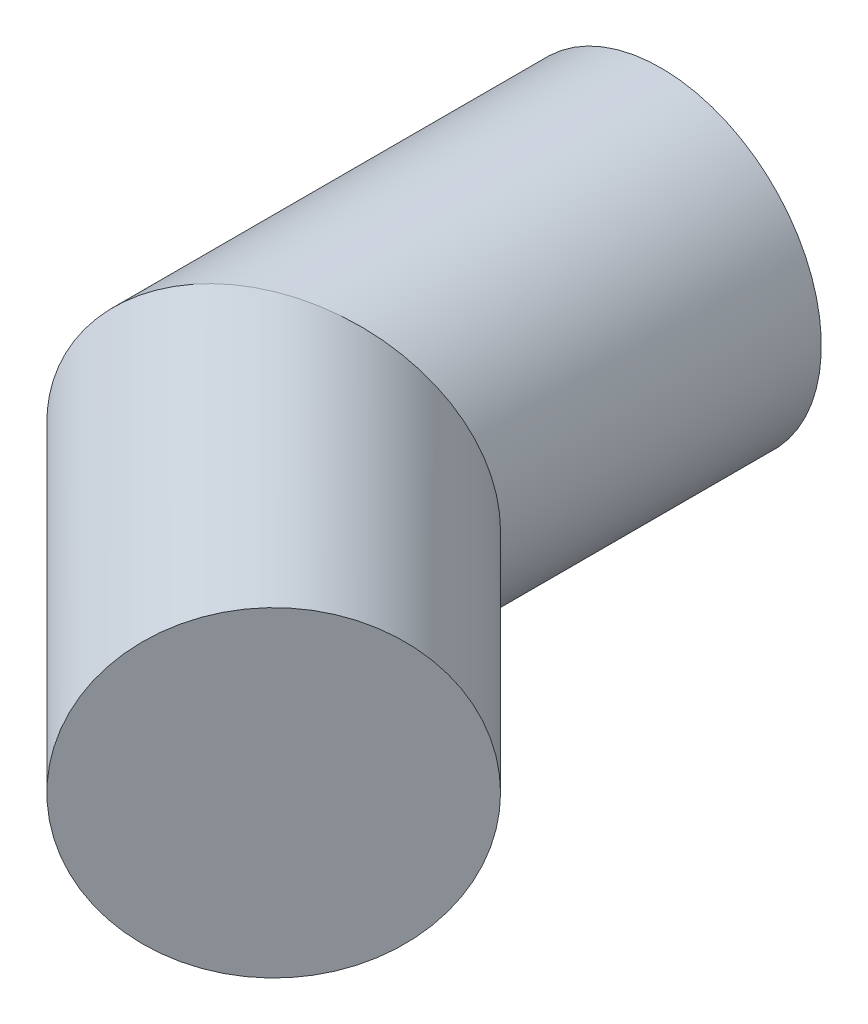
ISO-10303-21;
HEADER;
FILE_DESCRIPTION(('STEP AP214'),'2;1');
FILE_NAME('part.step','',(''),(''),'','','');
FILE_SCHEMA(('AUTOMOTIVE_DESIGN { 1 0 10303 214 1 1 1 1 }'));
ENDSEC;
DATA;
#1=APPLICATION_CONTEXT('core data for automotive mechanical design processes');
#2=APPLICATION_PROTOCOL_DEFINITION('international standard','automotive_design',2000,#1);
#3=PRODUCT_CONTEXT('',#1,'mechanical');
#4=PRODUCT('Part','Part','',(#3));
#5=PRODUCT_RELATED_PRODUCT_CATEGORY('part','',(#4));
#6=PRODUCT_DEFINITION_FORMATION('','',#4);
#7=PRODUCT_DEFINITION_CONTEXT('part definition',#1,'design');
#8=PRODUCT_DEFINITION('design','',#6,#7);
#9=PRODUCT_DEFINITION_SHAPE('','',#8);
#10=(LENGTH_UNIT() NAMED_UNIT(*) SI_UNIT(.MILLI.,.METRE.));
#11=(NAMED_UNIT(*) PLANE_ANGLE_UNIT() SI_UNIT($,.RADIAN.));
#12=(NAMED_UNIT(*) SI_UNIT($,.STERADIAN.) SOLID_ANGLE_UNIT());
#13=UNCERTAINTY_MEASURE_WITH_UNIT(LENGTH_MEASURE(1.E-05),#10,'distance_accuracy_value','');
#14=(GEOMETRIC_REPRESENTATION_CONTEXT(3) GLOBAL_UNCERTAINTY_ASSIGNED_CONTEXT((#13)) GLOBAL_UNIT_ASSIGNED_CONTEXT((#10,
#11,#12)) REPRESENTATION_CONTEXT('',''));
#15=CARTESIAN_POINT('',(0.,0.,0.));
#16=DIRECTION('',(0.,0.,1.));
#17=DIRECTION('',(1.,0.,0.));
#18=AXIS2_PLACEMENT_3D('',#15,#16,#17);
#19=CARTESIAN_POINT('',(-3.87020093855687,2.12701409724207E-06,77.4609394969551));
#20=DIRECTION('',(0.,0.,-1.));
#21=DIRECTION('',(-1.,0.,0.));
#22=AXIS2_PLACEMENT_3D('',#19,#20,#21);
#23=CYLINDRICAL_SURFACE('',#22,20.);
#24=CARTESIAN_POINT('',(-3.87020093855687,2.12701409724207E-06,5.74521074441703));
#25=DIRECTION('',(0.38268343236509,0.,0.923879532511287));
#26=DIRECTION('',(0.923879532511287,0.,-0.38268343236509));
#27=AXIS2_PLACEMENT_3D('',#24,#25,#26);
#28=ELLIPSE('',#27,21.6478440058479,20.);
#29=CARTESIAN_POINT('',(16.1297990614431,2.12701409724207E-06,-2.53906050304487));
#30=VERTEX_POINT('',#29);
#31=EDGE_CURVE('E10',#30,#30,#28,.T.);
#32=ORIENTED_EDGE('',*,*,#31,.F.);
#33=EDGE_LOOP('',(#32));
#34=FACE_BOUND('',#33,.T.);
#35=CARTESIAN_POINT('',(-3.87020093855687,2.12701409724207E-06,-42.5390605030449));
#36=DIRECTION('',(0.,0.,-1.));
#37=DIRECTION('',(-1.,0.,0.));
#38=AXIS2_PLACEMENT_3D('',#35,#36,#37);
#39=CIRCLE('',#38,20.);
#40=CARTESIAN_POINT('',(-23.8702009385569,2.12701409724207E-06,-42.5390605030449));
#41=VERTEX_POINT('',#40);
#42=EDGE_CURVE('E44',#41,#41,#39,.T.);
#43=ORIENTED_EDGE('',*,*,#42,.F.);
#44=EDGE_LOOP('',(#43));
#45=FACE_BOUND('',#44,.T.);
#46=ADVANCED_FACE('F38',(#34,#45),#23,.T.);
#47=CARTESIAN_POINT('',(-54.5808790572116,2.12701409724207E-06,-44.9654673742377));
#48=DIRECTION('',(0.707106781186548,0.,0.707106781186548));
#49=DIRECTION('',(0.707106781186548,0.,-0.707106781186548));
#50=AXIS2_PLACEMENT_3D('',#47,#48,#49);
#51=CYLINDRICAL_SURFACE('',#50,20.);
#52=ORIENTED_EDGE('',*,*,#31,.T.);
#53=EDGE_LOOP('',(#52));
#54=FACE_BOUND('',#53,.T.);
#55=CARTESIAN_POINT('',(30.2719346851741,2.12701409724207E-06,39.887346368148));
#56=DIRECTION('',(0.707106781186548,0.,0.707106781186547));
#57=DIRECTION('',(0.707106781186547,0.,-0.707106781186548));
#58=AXIS2_PLACEMENT_3D('',#55,#56,#57);
#59=CIRCLE('',#58,20.);
#60=CARTESIAN_POINT('',(44.414070308905,2.12701409724207E-06,25.745210744417));
#61=VERTEX_POINT('',#60);
#62=EDGE_CURVE('E48',#61,#61,#59,.T.);
#63=ORIENTED_EDGE('',*,*,#62,.F.);
#64=EDGE_LOOP('',(#63));
#65=FACE_BOUND('',#64,.T.);
#66=ADVANCED_FACE('F57',(#54,#65),#51,.T.);
#67=CARTESIAN_POINT('',(-3.87020093855687,2.12701409724207E-06,-42.5390605030449));
#68=DIRECTION('',(0.,0.,-1.));
#69=DIRECTION('',(-1.,0.,0.));
#70=AXIS2_PLACEMENT_3D('',#67,#68,#69);
#71=PLANE('',#70);
#72=ORIENTED_EDGE('',*,*,#42,.T.);
#73=EDGE_LOOP('',(#72));
#74=FACE_BOUND('',#73,.T.);
#75=ADVANCED_FACE('F59',(#74),#71,.T.);
#76=CARTESIAN_POINT('',(30.2719346851741,2.12701409724207E-06,39.887346368148));
#77=DIRECTION('',(0.707106781186548,0.,0.707106781186547));
#78=DIRECTION('',(0.707106781186547,0.,-0.707106781186548));
#79=AXIS2_PLACEMENT_3D('',#76,#77,#78);
#80=PLANE('',#79);
#81=ORIENTED_EDGE('',*,*,#62,.T.);
#82=EDGE_LOOP('',(#81));
#83=FACE_BOUND('',#82,.T.);
#84=ADVANCED_FACE('F55',(#83),#80,.T.);
#85=CLOSED_SHELL('',(#46,#66,#75,#84));
#86=MANIFOLD_SOLID_BREP('B2',#85);
#87=ADVANCED_BREP_SHAPE_REPRESENTATION('',(#18,#86),#14);
#88=SHAPE_DEFINITION_REPRESENTATION(#9,#87);
ENDSEC;
END-ISO-10303-21;
